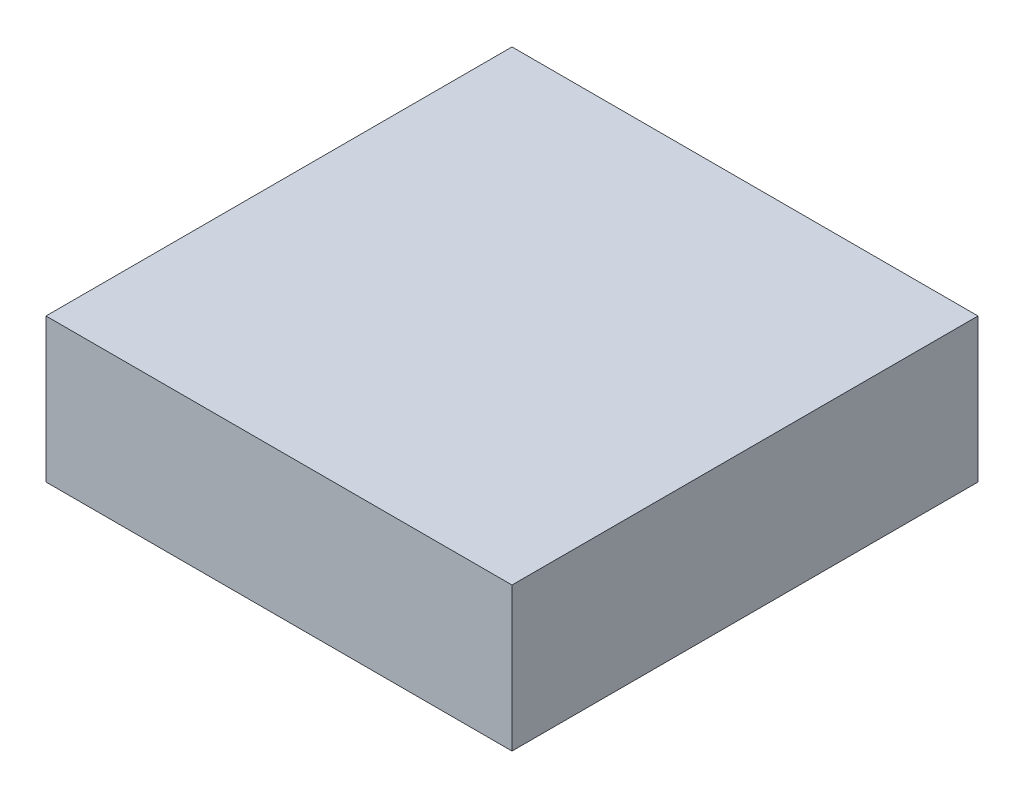
ISO-10303-21;
HEADER;
FILE_DESCRIPTION(('STEP AP214'),'2;1');
FILE_NAME('part.step','',(''),(''),'','','');
FILE_SCHEMA(('AUTOMOTIVE_DESIGN { 1 0 10303 214 1 1 1 1 }'));
ENDSEC;
DATA;
#1=APPLICATION_CONTEXT('core data for automotive mechanical design processes');
#2=APPLICATION_PROTOCOL_DEFINITION('international standard','automotive_design',2000,#1);
#3=PRODUCT_CONTEXT('',#1,'mechanical');
#4=PRODUCT('Part','Part','',(#3));
#5=PRODUCT_RELATED_PRODUCT_CATEGORY('part','',(#4));
#6=PRODUCT_DEFINITION_FORMATION('','',#4);
#7=PRODUCT_DEFINITION_CONTEXT('part definition',#1,'design');
#8=PRODUCT_DEFINITION('design','',#6,#7);
#9=PRODUCT_DEFINITION_SHAPE('','',#8);
#10=(LENGTH_UNIT() NAMED_UNIT(*) SI_UNIT(.MILLI.,.METRE.));
#11=(NAMED_UNIT(*) PLANE_ANGLE_UNIT() SI_UNIT($,.RADIAN.));
#12=(NAMED_UNIT(*) SI_UNIT($,.STERADIAN.) SOLID_ANGLE_UNIT());
#13=UNCERTAINTY_MEASURE_WITH_UNIT(LENGTH_MEASURE(1.E-05),#10,'distance_accuracy_value','');
#14=(GEOMETRIC_REPRESENTATION_CONTEXT(3) GLOBAL_UNCERTAINTY_ASSIGNED_CONTEXT((#13)) GLOBAL_UNIT_ASSIGNED_CONTEXT((#10,
#11,#12)) REPRESENTATION_CONTEXT('',''));
#15=CARTESIAN_POINT('',(0.,0.,0.));
#16=DIRECTION('',(0.,0.,1.));
#17=DIRECTION('',(1.,0.,0.));
#18=AXIS2_PLACEMENT_3D('',#15,#16,#17);
#19=CARTESIAN_POINT('',(-32.4,20.,32.4));
#20=DIRECTION('',(1.,0.,0.));
#21=DIRECTION('',(0.,0.,-1.));
#22=AXIS2_PLACEMENT_3D('',#19,#20,#21);
#23=PLANE('',#22);
#24=DIRECTION('',(0.,0.,1.));
#25=VECTOR('',#24,1.);
#26=CARTESIAN_POINT('',(-32.4,0.,32.4));
#27=LINE('',#26,#25);
#28=CARTESIAN_POINT('',(-32.4,0.,-32.4));
#29=VERTEX_POINT('',#28);
#30=CARTESIAN_POINT('',(-32.4,0.,32.4));
#31=VERTEX_POINT('',#30);
#32=EDGE_CURVE('E96',#29,#31,#27,.T.);
#33=ORIENTED_EDGE('',*,*,#32,.T.);
#34=DIRECTION('',(0.,-1.,0.));
#35=VECTOR('',#34,1.);
#36=CARTESIAN_POINT('',(-32.4,20.,32.4));
#37=LINE('',#36,#35);
#38=CARTESIAN_POINT('',(-32.4,20.,32.4));
#39=VERTEX_POINT('',#38);
#40=EDGE_CURVE('E11',#39,#31,#37,.T.);
#41=ORIENTED_EDGE('',*,*,#40,.F.);
#42=DIRECTION('',(0.,0.,1.));
#43=VECTOR('',#42,1.);
#44=CARTESIAN_POINT('',(-32.4,20.,32.4));
#45=LINE('',#44,#43);
#46=CARTESIAN_POINT('',(-32.4,20.,-32.4));
#47=VERTEX_POINT('',#46);
#48=EDGE_CURVE('E84',#47,#39,#45,.T.);
#49=ORIENTED_EDGE('',*,*,#48,.F.);
#50=DIRECTION('',(0.,-1.,0.));
#51=VECTOR('',#50,1.);
#52=CARTESIAN_POINT('',(-32.4,20.,-32.4));
#53=LINE('',#52,#51);
#54=EDGE_CURVE('E92',#47,#29,#53,.T.);
#55=ORIENTED_EDGE('',*,*,#54,.T.);
#56=EDGE_LOOP('',(#33,#41,#49,#55));
#57=FACE_BOUND('',#56,.T.);
#58=ADVANCED_FACE('F33',(#57),#23,.F.);
#59=CARTESIAN_POINT('',(32.4,20.,32.4));
#60=DIRECTION('',(0.,0.,-1.));
#61=DIRECTION('',(-1.,0.,0.));
#62=AXIS2_PLACEMENT_3D('',#59,#60,#61);
#63=PLANE('',#62);
#64=DIRECTION('',(1.,0.,0.));
#65=VECTOR('',#64,1.);
#66=CARTESIAN_POINT('',(32.4,0.,32.4));
#67=LINE('',#66,#65);
#68=CARTESIAN_POINT('',(32.4,0.,32.4));
#69=VERTEX_POINT('',#68);
#70=EDGE_CURVE('E88',#31,#69,#67,.T.);
#71=ORIENTED_EDGE('',*,*,#70,.T.);
#72=DIRECTION('',(0.,-1.,0.));
#73=VECTOR('',#72,1.);
#74=CARTESIAN_POINT('',(32.4,20.,32.4));
#75=LINE('',#74,#73);
#76=CARTESIAN_POINT('',(32.4,20.,32.4));
#77=VERTEX_POINT('',#76);
#78=EDGE_CURVE('E41',#77,#69,#75,.T.);
#79=ORIENTED_EDGE('',*,*,#78,.F.);
#80=DIRECTION('',(1.,0.,0.));
#81=VECTOR('',#80,1.);
#82=CARTESIAN_POINT('',(32.4,20.,32.4));
#83=LINE('',#82,#81);
#84=EDGE_CURVE('E79',#39,#77,#83,.T.);
#85=ORIENTED_EDGE('',*,*,#84,.F.);
#86=ORIENTED_EDGE('',*,*,#40,.T.);
#87=EDGE_LOOP('',(#71,#79,#85,#86));
#88=FACE_BOUND('',#87,.T.);
#89=ADVANCED_FACE('F87',(#88),#63,.F.);
#90=CARTESIAN_POINT('',(32.4,20.,32.4));
#91=DIRECTION('',(-1.,0.,0.));
#92=DIRECTION('',(0.,0.,1.));
#93=AXIS2_PLACEMENT_3D('',#90,#91,#92);
#94=PLANE('',#93);
#95=DIRECTION('',(0.,0.,-1.));
#96=VECTOR('',#95,1.);
#97=CARTESIAN_POINT('',(32.4,0.,32.4));
#98=LINE('',#97,#96);
#99=CARTESIAN_POINT('',(32.4,0.,-32.4));
#100=VERTEX_POINT('',#99);
#101=EDGE_CURVE('E66',#69,#100,#98,.T.);
#102=ORIENTED_EDGE('',*,*,#101,.T.);
#103=DIRECTION('',(0.,-1.,0.));
#104=VECTOR('',#103,1.);
#105=CARTESIAN_POINT('',(32.4,20.,-32.4));
#106=LINE('',#105,#104);
#107=CARTESIAN_POINT('',(32.4,20.,-32.4));
#108=VERTEX_POINT('',#107);
#109=EDGE_CURVE('E89',#108,#100,#106,.T.);
#110=ORIENTED_EDGE('',*,*,#109,.F.);
#111=DIRECTION('',(0.,0.,-1.));
#112=VECTOR('',#111,1.);
#113=CARTESIAN_POINT('',(32.4,20.,32.4));
#114=LINE('',#113,#112);
#115=EDGE_CURVE('E82',#77,#108,#114,.T.);
#116=ORIENTED_EDGE('',*,*,#115,.F.);
#117=ORIENTED_EDGE('',*,*,#78,.T.);
#118=EDGE_LOOP('',(#102,#110,#116,#117));
#119=FACE_BOUND('',#118,.T.);
#120=ADVANCED_FACE('F90',(#119),#94,.F.);
#121=CARTESIAN_POINT('',(32.4,20.,-32.4));
#122=DIRECTION('',(0.,0.,1.));
#123=DIRECTION('',(1.,0.,0.));
#124=AXIS2_PLACEMENT_3D('',#121,#122,#123);
#125=PLANE('',#124);
#126=DIRECTION('',(-1.,0.,0.));
#127=VECTOR('',#126,1.);
#128=CARTESIAN_POINT('',(32.4,0.,-32.4));
#129=LINE('',#128,#127);
#130=EDGE_CURVE('E72',#100,#29,#129,.T.);
#131=ORIENTED_EDGE('',*,*,#130,.T.);
#132=ORIENTED_EDGE('',*,*,#54,.F.);
#133=DIRECTION('',(-1.,0.,0.));
#134=VECTOR('',#133,1.);
#135=CARTESIAN_POINT('',(32.4,20.,-32.4));
#136=LINE('',#135,#134);
#137=EDGE_CURVE('E49',#108,#47,#136,.T.);
#138=ORIENTED_EDGE('',*,*,#137,.F.);
#139=ORIENTED_EDGE('',*,*,#109,.T.);
#140=EDGE_LOOP('',(#131,#132,#138,#139));
#141=FACE_BOUND('',#140,.T.);
#142=ADVANCED_FACE('F103',(#141),#125,.F.);
#143=CARTESIAN_POINT('',(0.,20.,0.));
#144=DIRECTION('',(0.,1.,0.));
#145=DIRECTION('',(0.,0.,1.));
#146=AXIS2_PLACEMENT_3D('',#143,#144,#145);
#147=PLANE('',#146);
#148=ORIENTED_EDGE('',*,*,#48,.T.);
#149=ORIENTED_EDGE('',*,*,#84,.T.);
#150=ORIENTED_EDGE('',*,*,#115,.T.);
#151=ORIENTED_EDGE('',*,*,#137,.T.);
#152=EDGE_LOOP('',(#148,#149,#150,#151));
#153=FACE_BOUND('',#152,.T.);
#154=ADVANCED_FACE('F80',(#153),#147,.T.);
#155=CARTESIAN_POINT('',(0.,0.,0.));
#156=DIRECTION('',(0.,1.,0.));
#157=DIRECTION('',(0.,0.,1.));
#158=AXIS2_PLACEMENT_3D('',#155,#156,#157);
#159=PLANE('',#158);
#160=ORIENTED_EDGE('',*,*,#32,.F.);
#161=ORIENTED_EDGE('',*,*,#130,.F.);
#162=ORIENTED_EDGE('',*,*,#101,.F.);
#163=ORIENTED_EDGE('',*,*,#70,.F.);
#164=EDGE_LOOP('',(#160,#161,#162,#163));
#165=FACE_BOUND('',#164,.T.);
#166=ADVANCED_FACE('F106',(#165),#159,.F.);
#167=CLOSED_SHELL('',(#58,#89,#120,#142,#154,#166));
#168=MANIFOLD_SOLID_BREP('B2',#167);
#169=ADVANCED_BREP_SHAPE_REPRESENTATION('',(#18,#168),#14);
#170=SHAPE_DEFINITION_REPRESENTATION(#9,#169);
ENDSEC;
END-ISO-10303-21;
